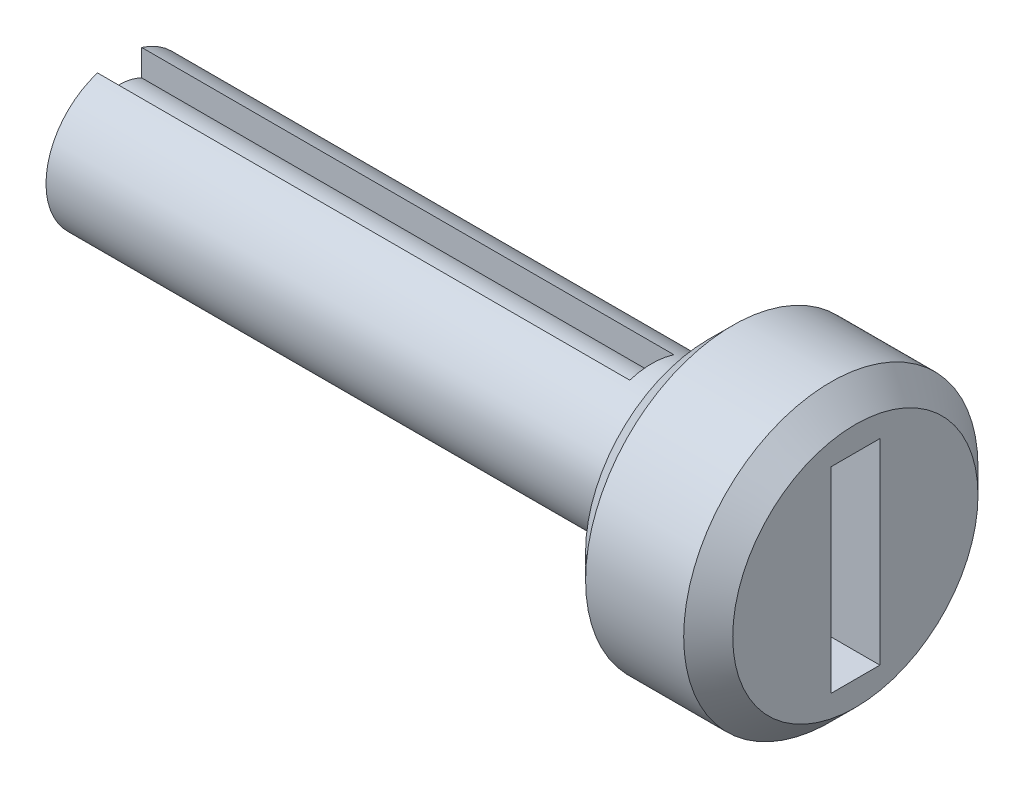
ISO-10303-21;
HEADER;
FILE_DESCRIPTION(('STEP AP214'),'2;1');
FILE_NAME('part.step','',(''),(''),'','','');
FILE_SCHEMA(('AUTOMOTIVE_DESIGN { 1 0 10303 214 1 1 1 1 }'));
ENDSEC;
DATA;
#1=APPLICATION_CONTEXT('core data for automotive mechanical design processes');
#2=APPLICATION_PROTOCOL_DEFINITION('international standard','automotive_design',2000,#1);
#3=PRODUCT_CONTEXT('',#1,'mechanical');
#4=PRODUCT('Part','Part','',(#3));
#5=PRODUCT_RELATED_PRODUCT_CATEGORY('part','',(#4));
#6=PRODUCT_DEFINITION_FORMATION('','',#4);
#7=PRODUCT_DEFINITION_CONTEXT('part definition',#1,'design');
#8=PRODUCT_DEFINITION('design','',#6,#7);
#9=PRODUCT_DEFINITION_SHAPE('','',#8);
#10=(LENGTH_UNIT() NAMED_UNIT(*) SI_UNIT(.MILLI.,.METRE.));
#11=(NAMED_UNIT(*) PLANE_ANGLE_UNIT() SI_UNIT($,.RADIAN.));
#12=(NAMED_UNIT(*) SI_UNIT($,.STERADIAN.) SOLID_ANGLE_UNIT());
#13=UNCERTAINTY_MEASURE_WITH_UNIT(LENGTH_MEASURE(1.E-05),#10,'distance_accuracy_value','');
#14=(GEOMETRIC_REPRESENTATION_CONTEXT(3) GLOBAL_UNCERTAINTY_ASSIGNED_CONTEXT((#13)) GLOBAL_UNIT_ASSIGNED_CONTEXT((#10,
#11,#12)) REPRESENTATION_CONTEXT('',''));
#15=CARTESIAN_POINT('',(0.,0.,0.));
#16=DIRECTION('',(0.,0.,1.));
#17=DIRECTION('',(1.,0.,0.));
#18=AXIS2_PLACEMENT_3D('',#15,#16,#17);
#19=CARTESIAN_POINT('',(0.,0.,0.));
#20=DIRECTION('',(1.,0.,0.));
#21=DIRECTION('',(0.,0.,-1.));
#22=AXIS2_PLACEMENT_3D('',#19,#20,#21);
#23=PLANE('',#22);
#24=CARTESIAN_POINT('',(0.,0.,0.));
#25=DIRECTION('',(-1.,0.,0.));
#26=DIRECTION('',(0.,0.,1.));
#27=AXIS2_PLACEMENT_3D('',#24,#25,#26);
#28=CIRCLE('',#27,1.2);
#29=CARTESIAN_POINT('',(0.,0.,1.2));
#30=VERTEX_POINT('',#29);
#31=EDGE_CURVE('E216',#30,#30,#28,.T.);
#32=ORIENTED_EDGE('',*,*,#31,.F.);
#33=EDGE_LOOP('',(#32));
#34=FACE_BOUND('',#33,.T.);
#35=CARTESIAN_POINT('',(0.,0.,0.));
#36=DIRECTION('',(1.,0.,0.));
#37=DIRECTION('',(0.,0.,1.));
#38=AXIS2_PLACEMENT_3D('',#35,#36,#37);
#39=CIRCLE('',#38,2.);
#40=CARTESIAN_POINT('',(0.,-1.78605710994917,0.9));
#41=VERTEX_POINT('',#40);
#42=CARTESIAN_POINT('',(0.,-1.78605710994917,-0.9));
#43=VERTEX_POINT('',#42);
#44=EDGE_CURVE('E148',#41,#43,#39,.T.);
#45=ORIENTED_EDGE('',*,*,#44,.F.);
#46=DIRECTION('',(0.,1.,0.));
#47=VECTOR('',#46,1.);
#48=CARTESIAN_POINT('',(0.,-1.78605710994917,0.9));
#49=LINE('',#48,#47);
#50=CARTESIAN_POINT('',(0.,-2.86181760425084,0.9));
#51=VERTEX_POINT('',#50);
#52=EDGE_CURVE('E140',#51,#41,#49,.T.);
#53=ORIENTED_EDGE('',*,*,#52,.F.);
#54=CARTESIAN_POINT('',(0.,0.,0.));
#55=DIRECTION('',(-1.,0.,0.));
#56=DIRECTION('',(0.,0.,1.));
#57=AXIS2_PLACEMENT_3D('',#54,#55,#56);
#58=CIRCLE('',#57,3.);
#59=CARTESIAN_POINT('',(0.,2.86181760425084,0.9));
#60=VERTEX_POINT('',#59);
#61=EDGE_CURVE('E57',#51,#60,#58,.T.);
#62=ORIENTED_EDGE('',*,*,#61,.T.);
#63=DIRECTION('',(0.,1.,0.));
#64=VECTOR('',#63,1.);
#65=CARTESIAN_POINT('',(0.,2.86181760425084,0.9));
#66=LINE('',#65,#64);
#67=CARTESIAN_POINT('',(0.,1.78605710994917,0.9));
#68=VERTEX_POINT('',#67);
#69=EDGE_CURVE('E162',#68,#60,#66,.T.);
#70=ORIENTED_EDGE('',*,*,#69,.F.);
#71=CARTESIAN_POINT('',(0.,0.,0.));
#72=DIRECTION('',(1.,0.,0.));
#73=DIRECTION('',(0.,0.,1.));
#74=AXIS2_PLACEMENT_3D('',#71,#72,#73);
#75=CIRCLE('',#74,2.);
#76=CARTESIAN_POINT('',(0.,1.78605710994917,-0.9));
#77=VERTEX_POINT('',#76);
#78=EDGE_CURVE('E165',#77,#68,#75,.T.);
#79=ORIENTED_EDGE('',*,*,#78,.F.);
#80=DIRECTION('',(0.,-1.,0.));
#81=VECTOR('',#80,1.);
#82=CARTESIAN_POINT('',(0.,2.86181760425084,-0.9));
#83=LINE('',#82,#81);
#84=CARTESIAN_POINT('',(0.,2.86181760425084,-0.9));
#85=VERTEX_POINT('',#84);
#86=EDGE_CURVE('E161',#85,#77,#83,.T.);
#87=ORIENTED_EDGE('',*,*,#86,.F.);
#88=CARTESIAN_POINT('',(0.,-2.86181760425084,-0.9));
#89=VERTEX_POINT('',#88);
#90=EDGE_CURVE('E231',#85,#89,#58,.T.);
#91=ORIENTED_EDGE('',*,*,#90,.T.);
#92=DIRECTION('',(0.,-1.,0.));
#93=VECTOR('',#92,1.);
#94=CARTESIAN_POINT('',(0.,-1.78605710994917,-0.9));
#95=LINE('',#94,#93);
#96=EDGE_CURVE('E49',#43,#89,#95,.T.);
#97=ORIENTED_EDGE('',*,*,#96,.F.);
#98=EDGE_LOOP('',(#45,#53,#62,#70,#79,#87,#91,#97));
#99=FACE_BOUND('',#98,.T.);
#100=ADVANCED_FACE('F34',(#34,#99),#23,.F.);
#101=CARTESIAN_POINT('',(0.,0.,0.));
#102=DIRECTION('',(-1.,0.,0.));
#103=DIRECTION('',(0.,0.,1.));
#104=AXIS2_PLACEMENT_3D('',#101,#102,#103);
#105=CYLINDRICAL_SURFACE('',#104,3.);
#106=ORIENTED_EDGE('',*,*,#61,.F.);
#107=DIRECTION('',(-1.,0.,0.));
#108=VECTOR('',#107,1.);
#109=CARTESIAN_POINT('',(26.171095884641,-2.86181760425084,0.900000000000001));
#110=LINE('',#109,#108);
#111=CARTESIAN_POINT('',(21.7,-2.86181760425084,0.900000000000001));
#112=VERTEX_POINT('',#111);
#113=EDGE_CURVE('E154',#112,#51,#110,.T.);
#114=ORIENTED_EDGE('',*,*,#113,.F.);
#115=CARTESIAN_POINT('',(21.7,0.,0.));
#116=DIRECTION('',(1.,0.,0.));
#117=DIRECTION('',(0.,0.,-1.));
#118=AXIS2_PLACEMENT_3D('',#115,#116,#117);
#119=CIRCLE('',#118,3.);
#120=CARTESIAN_POINT('',(21.7,-2.86181760425084,-0.899999999999999));
#121=VERTEX_POINT('',#120);
#122=EDGE_CURVE('E145',#121,#112,#119,.F.);
#123=ORIENTED_EDGE('',*,*,#122,.F.);
#124=DIRECTION('',(-1.,0.,0.));
#125=VECTOR('',#124,1.);
#126=CARTESIAN_POINT('',(26.171095884641,-2.86181760425084,-0.899999999999999));
#127=LINE('',#126,#125);
#128=EDGE_CURVE('E155',#121,#89,#127,.T.);
#129=ORIENTED_EDGE('',*,*,#128,.T.);
#130=ORIENTED_EDGE('',*,*,#90,.F.);
#131=DIRECTION('',(-1.,0.,0.));
#132=VECTOR('',#131,1.);
#133=CARTESIAN_POINT('',(26.171095884641,2.86181760425084,-0.899999999999999));
#134=LINE('',#133,#132);
#135=CARTESIAN_POINT('',(21.7,2.86181760425084,-0.899999999999999));
#136=VERTEX_POINT('',#135);
#137=EDGE_CURVE('E176',#136,#85,#134,.T.);
#138=ORIENTED_EDGE('',*,*,#137,.F.);
#139=CARTESIAN_POINT('',(21.7,0.,0.));
#140=DIRECTION('',(1.,0.,0.));
#141=DIRECTION('',(0.,0.,-1.));
#142=AXIS2_PLACEMENT_3D('',#139,#140,#141);
#143=CIRCLE('',#142,3.);
#144=CARTESIAN_POINT('',(21.7,2.86181760425084,0.900000000000001));
#145=VERTEX_POINT('',#144);
#146=EDGE_CURVE('E173',#145,#136,#143,.F.);
#147=ORIENTED_EDGE('',*,*,#146,.F.);
#148=DIRECTION('',(-1.,0.,0.));
#149=VECTOR('',#148,1.);
#150=CARTESIAN_POINT('',(26.171095884641,2.86181760425084,0.900000000000001));
#151=LINE('',#150,#149);
#152=EDGE_CURVE('E177',#145,#60,#151,.T.);
#153=ORIENTED_EDGE('',*,*,#152,.T.);
#154=EDGE_LOOP('',(#106,#114,#123,#129,#130,#138,#147,#153));
#155=FACE_BOUND('',#154,.T.);
#156=CARTESIAN_POINT('',(24.,0.,0.));
#157=DIRECTION('',(-1.,0.,0.));
#158=DIRECTION('',(0.,0.,1.));
#159=AXIS2_PLACEMENT_3D('',#156,#157,#158);
#160=CIRCLE('',#159,3.);
#161=CARTESIAN_POINT('',(24.,0.,3.));
#162=VERTEX_POINT('',#161);
#163=EDGE_CURVE('E228',#162,#162,#160,.T.);
#164=ORIENTED_EDGE('',*,*,#163,.T.);
#165=EDGE_LOOP('',(#164));
#166=FACE_BOUND('',#165,.T.);
#167=ADVANCED_FACE('F265',(#155,#166),#105,.T.);
#168=CARTESIAN_POINT('',(24.,0.,-3.));
#169=DIRECTION('',(1.,0.,0.));
#170=DIRECTION('',(0.,0.,-1.));
#171=AXIS2_PLACEMENT_3D('',#168,#169,#170);
#172=PLANE('',#171);
#173=CARTESIAN_POINT('',(24.,0.,0.));
#174=DIRECTION('',(1.,0.,0.));
#175=DIRECTION('',(0.,0.,-1.));
#176=AXIS2_PLACEMENT_3D('',#173,#174,#175);
#177=CIRCLE('',#176,5.);
#178=CARTESIAN_POINT('',(24.,0.,-5.));
#179=VERTEX_POINT('',#178);
#180=EDGE_CURVE('E13',#179,#179,#177,.F.);
#181=ORIENTED_EDGE('',*,*,#180,.T.);
#182=EDGE_LOOP('',(#181));
#183=FACE_BOUND('',#182,.T.);
#184=ORIENTED_EDGE('',*,*,#163,.F.);
#185=EDGE_LOOP('',(#184));
#186=FACE_BOUND('',#185,.T.);
#187=ADVANCED_FACE('F254',(#183,#186),#172,.F.);
#188=CARTESIAN_POINT('',(0.,0.,0.));
#189=DIRECTION('',(-1.,0.,0.));
#190=DIRECTION('',(0.,0.,1.));
#191=AXIS2_PLACEMENT_3D('',#188,#189,#190);
#192=CYLINDRICAL_SURFACE('',#191,6.);
#193=CARTESIAN_POINT('',(29.,0.,0.));
#194=DIRECTION('',(-1.,0.,0.));
#195=DIRECTION('',(0.,0.,1.));
#196=AXIS2_PLACEMENT_3D('',#193,#194,#195);
#197=CIRCLE('',#196,6.);
#198=CARTESIAN_POINT('',(29.,0.,6.));
#199=VERTEX_POINT('',#198);
#200=EDGE_CURVE('E237',#199,#199,#197,.T.);
#201=ORIENTED_EDGE('',*,*,#200,.T.);
#202=EDGE_LOOP('',(#201));
#203=FACE_BOUND('',#202,.T.);
#204=CARTESIAN_POINT('',(25.,0.,0.));
#205=DIRECTION('',(1.,0.,0.));
#206=DIRECTION('',(0.,0.,-1.));
#207=AXIS2_PLACEMENT_3D('',#204,#205,#206);
#208=CIRCLE('',#207,6.);
#209=CARTESIAN_POINT('',(25.,0.,-6.));
#210=VERTEX_POINT('',#209);
#211=EDGE_CURVE('E234',#210,#210,#208,.T.);
#212=ORIENTED_EDGE('',*,*,#211,.T.);
#213=EDGE_LOOP('',(#212));
#214=FACE_BOUND('',#213,.T.);
#215=ADVANCED_FACE('F251',(#203,#214),#192,.T.);
#216=CARTESIAN_POINT('',(30.,0.,-6.));
#217=DIRECTION('',(-1.,0.,0.));
#218=DIRECTION('',(0.,0.,1.));
#219=AXIS2_PLACEMENT_3D('',#216,#217,#218);
#220=PLANE('',#219);
#221=CARTESIAN_POINT('',(30.,0.,0.));
#222=DIRECTION('',(-1.,0.,0.));
#223=DIRECTION('',(0.,0.,1.));
#224=AXIS2_PLACEMENT_3D('',#221,#222,#223);
#225=CIRCLE('',#224,5.);
#226=CARTESIAN_POINT('',(30.,0.,5.));
#227=VERTEX_POINT('',#226);
#228=EDGE_CURVE('E42',#227,#227,#225,.F.);
#229=ORIENTED_EDGE('',*,*,#228,.T.);
#230=EDGE_LOOP('',(#229));
#231=FACE_BOUND('',#230,.T.);
#232=DIRECTION('',(0.,0.,1.));
#233=VECTOR('',#232,1.);
#234=CARTESIAN_POINT('',(30.,4.,1.));
#235=LINE('',#234,#233);
#236=CARTESIAN_POINT('',(30.,4.,-0.999999999999999));
#237=VERTEX_POINT('',#236);
#238=CARTESIAN_POINT('',(30.,4.,1.));
#239=VERTEX_POINT('',#238);
#240=EDGE_CURVE('E206',#237,#239,#235,.T.);
#241=ORIENTED_EDGE('',*,*,#240,.F.);
#242=DIRECTION('',(0.,1.,0.));
#243=VECTOR('',#242,1.);
#244=CARTESIAN_POINT('',(30.,-4.,-0.999999999999999));
#245=LINE('',#244,#243);
#246=CARTESIAN_POINT('',(30.,-4.,-0.999999999999999));
#247=VERTEX_POINT('',#246);
#248=EDGE_CURVE('E190',#247,#237,#245,.T.);
#249=ORIENTED_EDGE('',*,*,#248,.F.);
#250=DIRECTION('',(0.,0.,-1.));
#251=VECTOR('',#250,1.);
#252=CARTESIAN_POINT('',(30.,-4.,1.));
#253=LINE('',#252,#251);
#254=CARTESIAN_POINT('',(30.,-4.,1.));
#255=VERTEX_POINT('',#254);
#256=EDGE_CURVE('E195',#255,#247,#253,.T.);
#257=ORIENTED_EDGE('',*,*,#256,.F.);
#258=DIRECTION('',(0.,-1.,0.));
#259=VECTOR('',#258,1.);
#260=CARTESIAN_POINT('',(30.,-4.,1.));
#261=LINE('',#260,#259);
#262=EDGE_CURVE('E209',#239,#255,#261,.T.);
#263=ORIENTED_EDGE('',*,*,#262,.F.);
#264=EDGE_LOOP('',(#241,#249,#257,#263));
#265=FACE_BOUND('',#264,.T.);
#266=ADVANCED_FACE('F242',(#231,#265),#220,.F.);
#267=CARTESIAN_POINT('',(24.,0.,-3.));
#268=DIRECTION('',(1.,0.,0.));
#269=DIRECTION('',(0.,0.,-1.));
#270=AXIS2_PLACEMENT_3D('',#267,#268,#269);
#271=PLANE('',#270);
#272=CARTESIAN_POINT('',(24.,0.,0.));
#273=DIRECTION('',(1.,0.,0.));
#274=DIRECTION('',(0.,0.,-1.));
#275=AXIS2_PLACEMENT_3D('',#272,#273,#274);
#276=CIRCLE('',#275,1.2);
#277=CARTESIAN_POINT('',(24.,0.,-1.2));
#278=VERTEX_POINT('',#277);
#279=EDGE_CURVE('E225',#278,#278,#276,.F.);
#280=ORIENTED_EDGE('',*,*,#279,.T.);
#281=EDGE_LOOP('',(#280));
#282=FACE_BOUND('',#281,.T.);
#283=ADVANCED_FACE('F280',(#282),#271,.F.);
#284=CARTESIAN_POINT('',(27.3941125496954,0.,0.));
#285=DIRECTION('',(-1.,0.,0.));
#286=DIRECTION('',(0.,0.,1.));
#287=AXIS2_PLACEMENT_3D('',#284,#285,#286);
#288=CYLINDRICAL_SURFACE('',#287,1.2);
#289=ORIENTED_EDGE('',*,*,#31,.T.);
#290=EDGE_LOOP('',(#289));
#291=FACE_BOUND('',#290,.T.);
#292=ORIENTED_EDGE('',*,*,#279,.F.);
#293=EDGE_LOOP('',(#292));
#294=FACE_BOUND('',#293,.T.);
#295=ADVANCED_FACE('F283',(#291,#294),#288,.F.);
#296=CARTESIAN_POINT('',(26.,-4.,-0.999999999999999));
#297=DIRECTION('',(0.,0.,-1.));
#298=DIRECTION('',(-1.,0.,0.));
#299=AXIS2_PLACEMENT_3D('',#296,#297,#298);
#300=PLANE('',#299);
#301=ORIENTED_EDGE('',*,*,#248,.T.);
#302=DIRECTION('',(1.,0.,0.));
#303=VECTOR('',#302,1.);
#304=CARTESIAN_POINT('',(26.,4.,-0.999999999999999));
#305=LINE('',#304,#303);
#306=CARTESIAN_POINT('',(26.,4.,-0.999999999999999));
#307=VERTEX_POINT('',#306);
#308=EDGE_CURVE('E204',#307,#237,#305,.T.);
#309=ORIENTED_EDGE('',*,*,#308,.F.);
#310=DIRECTION('',(0.,1.,0.));
#311=VECTOR('',#310,1.);
#312=CARTESIAN_POINT('',(26.,-4.,-0.999999999999999));
#313=LINE('',#312,#311);
#314=CARTESIAN_POINT('',(26.,-4.,-0.999999999999999));
#315=VERTEX_POINT('',#314);
#316=EDGE_CURVE('E191',#315,#307,#313,.T.);
#317=ORIENTED_EDGE('',*,*,#316,.F.);
#318=DIRECTION('',(1.,0.,0.));
#319=VECTOR('',#318,1.);
#320=CARTESIAN_POINT('',(26.,-4.,-0.999999999999999));
#321=LINE('',#320,#319);
#322=EDGE_CURVE('E214',#315,#247,#321,.T.);
#323=ORIENTED_EDGE('',*,*,#322,.T.);
#324=EDGE_LOOP('',(#301,#309,#317,#323));
#325=FACE_BOUND('',#324,.T.);
#326=ADVANCED_FACE('F287',(#325),#300,.F.);
#327=CARTESIAN_POINT('',(26.,-4.,1.));
#328=DIRECTION('',(0.,-1.,0.));
#329=DIRECTION('',(0.,0.,-1.));
#330=AXIS2_PLACEMENT_3D('',#327,#328,#329);
#331=PLANE('',#330);
#332=ORIENTED_EDGE('',*,*,#256,.T.);
#333=ORIENTED_EDGE('',*,*,#322,.F.);
#334=DIRECTION('',(0.,0.,-1.));
#335=VECTOR('',#334,1.);
#336=CARTESIAN_POINT('',(26.,-4.,1.));
#337=LINE('',#336,#335);
#338=CARTESIAN_POINT('',(26.,-4.,1.));
#339=VERTEX_POINT('',#338);
#340=EDGE_CURVE('E201',#339,#315,#337,.T.);
#341=ORIENTED_EDGE('',*,*,#340,.F.);
#342=DIRECTION('',(1.,0.,0.));
#343=VECTOR('',#342,1.);
#344=CARTESIAN_POINT('',(26.,-4.,1.));
#345=LINE('',#344,#343);
#346=EDGE_CURVE('E217',#339,#255,#345,.T.);
#347=ORIENTED_EDGE('',*,*,#346,.T.);
#348=EDGE_LOOP('',(#332,#333,#341,#347));
#349=FACE_BOUND('',#348,.T.);
#350=ADVANCED_FACE('F291',(#349),#331,.F.);
#351=CARTESIAN_POINT('',(26.,-4.,1.));
#352=DIRECTION('',(0.,0.,1.));
#353=DIRECTION('',(1.,0.,0.));
#354=AXIS2_PLACEMENT_3D('',#351,#352,#353);
#355=PLANE('',#354);
#356=ORIENTED_EDGE('',*,*,#262,.T.);
#357=ORIENTED_EDGE('',*,*,#346,.F.);
#358=DIRECTION('',(0.,-1.,0.));
#359=VECTOR('',#358,1.);
#360=CARTESIAN_POINT('',(26.,-4.,1.));
#361=LINE('',#360,#359);
#362=CARTESIAN_POINT('',(26.,4.,1.));
#363=VERTEX_POINT('',#362);
#364=EDGE_CURVE('E198',#363,#339,#361,.T.);
#365=ORIENTED_EDGE('',*,*,#364,.F.);
#366=DIRECTION('',(1.,0.,0.));
#367=VECTOR('',#366,1.);
#368=CARTESIAN_POINT('',(26.,4.,1.));
#369=LINE('',#368,#367);
#370=EDGE_CURVE('E219',#363,#239,#369,.T.);
#371=ORIENTED_EDGE('',*,*,#370,.T.);
#372=EDGE_LOOP('',(#356,#357,#365,#371));
#373=FACE_BOUND('',#372,.T.);
#374=ADVANCED_FACE('F296',(#373),#355,.F.);
#375=CARTESIAN_POINT('',(26.,4.,1.));
#376=DIRECTION('',(0.,1.,0.));
#377=DIRECTION('',(0.,0.,1.));
#378=AXIS2_PLACEMENT_3D('',#375,#376,#377);
#379=PLANE('',#378);
#380=ORIENTED_EDGE('',*,*,#240,.T.);
#381=ORIENTED_EDGE('',*,*,#370,.F.);
#382=DIRECTION('',(0.,0.,1.));
#383=VECTOR('',#382,1.);
#384=CARTESIAN_POINT('',(26.,4.,1.));
#385=LINE('',#384,#383);
#386=EDGE_CURVE('E194',#307,#363,#385,.T.);
#387=ORIENTED_EDGE('',*,*,#386,.F.);
#388=ORIENTED_EDGE('',*,*,#308,.T.);
#389=EDGE_LOOP('',(#380,#381,#387,#388));
#390=FACE_BOUND('',#389,.T.);
#391=ADVANCED_FACE('F293',(#390),#379,.F.);
#392=CARTESIAN_POINT('',(26.,4.,-0.999999999999999));
#393=DIRECTION('',(-1.,0.,0.));
#394=DIRECTION('',(0.,0.,1.));
#395=AXIS2_PLACEMENT_3D('',#392,#393,#394);
#396=PLANE('',#395);
#397=ORIENTED_EDGE('',*,*,#316,.T.);
#398=ORIENTED_EDGE('',*,*,#386,.T.);
#399=ORIENTED_EDGE('',*,*,#364,.T.);
#400=ORIENTED_EDGE('',*,*,#340,.T.);
#401=EDGE_LOOP('',(#397,#398,#399,#400));
#402=FACE_BOUND('',#401,.T.);
#403=ADVANCED_FACE('F248',(#402),#396,.F.);
#404=CARTESIAN_POINT('',(29.,0.,0.));
#405=DIRECTION('',(-1.,0.,0.));
#406=DIRECTION('',(0.,0.,1.));
#407=AXIS2_PLACEMENT_3D('',#404,#405,#406);
#408=CONICAL_SURFACE('',#407,6.,0.78539816339745);
#409=ORIENTED_EDGE('',*,*,#228,.F.);
#410=EDGE_LOOP('',(#409));
#411=FACE_BOUND('',#410,.T.);
#412=ORIENTED_EDGE('',*,*,#200,.F.);
#413=EDGE_LOOP('',(#412));
#414=FACE_BOUND('',#413,.T.);
#415=ADVANCED_FACE('F245',(#411,#414),#408,.T.);
#416=CARTESIAN_POINT('',(24.,0.,0.));
#417=DIRECTION('',(1.,0.,0.));
#418=DIRECTION('',(0.,0.,-1.));
#419=AXIS2_PLACEMENT_3D('',#416,#417,#418);
#420=CONICAL_SURFACE('',#419,5.,0.785398163397447);
#421=ORIENTED_EDGE('',*,*,#211,.F.);
#422=EDGE_LOOP('',(#421));
#423=FACE_BOUND('',#422,.T.);
#424=ORIENTED_EDGE('',*,*,#180,.F.);
#425=EDGE_LOOP('',(#424));
#426=FACE_BOUND('',#425,.T.);
#427=ADVANCED_FACE('F36',(#423,#426),#420,.T.);
#428=CARTESIAN_POINT('',(21.7,0.,-3.));
#429=DIRECTION('',(1.,0.,0.));
#430=DIRECTION('',(0.,0.,-1.));
#431=AXIS2_PLACEMENT_3D('',#428,#429,#430);
#432=PLANE('',#431);
#433=ORIENTED_EDGE('',*,*,#146,.T.);
#434=DIRECTION('',(0.,-1.,0.));
#435=VECTOR('',#434,1.);
#436=CARTESIAN_POINT('',(21.7,2.86181760425084,-0.899999999999999));
#437=LINE('',#436,#435);
#438=CARTESIAN_POINT('',(21.7,1.78605710994917,-0.899999999999999));
#439=VERTEX_POINT('',#438);
#440=EDGE_CURVE('E164',#136,#439,#437,.T.);
#441=ORIENTED_EDGE('',*,*,#440,.T.);
#442=CARTESIAN_POINT('',(21.7,0.,0.));
#443=DIRECTION('',(1.,0.,0.));
#444=DIRECTION('',(0.,0.,-1.));
#445=AXIS2_PLACEMENT_3D('',#442,#443,#444);
#446=CIRCLE('',#445,2.);
#447=CARTESIAN_POINT('',(21.7,1.78605710994918,0.900000000000001));
#448=VERTEX_POINT('',#447);
#449=EDGE_CURVE('E182',#439,#448,#446,.T.);
#450=ORIENTED_EDGE('',*,*,#449,.T.);
#451=DIRECTION('',(0.,1.,0.));
#452=VECTOR('',#451,1.);
#453=CARTESIAN_POINT('',(21.7,2.86181760425084,0.900000000000001));
#454=LINE('',#453,#452);
#455=EDGE_CURVE('E178',#448,#145,#454,.T.);
#456=ORIENTED_EDGE('',*,*,#455,.T.);
#457=EDGE_LOOP('',(#433,#441,#450,#456));
#458=FACE_BOUND('',#457,.T.);
#459=ADVANCED_FACE('F260',(#458),#432,.F.);
#460=CARTESIAN_POINT('',(26.171095884641,2.86181760425084,-0.899999999999999));
#461=DIRECTION('',(0.,0.,-1.));
#462=DIRECTION('',(-1.,0.,0.));
#463=AXIS2_PLACEMENT_3D('',#460,#461,#462);
#464=PLANE('',#463);
#465=ORIENTED_EDGE('',*,*,#137,.T.);
#466=ORIENTED_EDGE('',*,*,#86,.T.);
#467=DIRECTION('',(-1.,0.,0.));
#468=VECTOR('',#467,1.);
#469=CARTESIAN_POINT('',(26.171095884641,1.78605710994917,-0.899999999999999));
#470=LINE('',#469,#468);
#471=EDGE_CURVE('E172',#439,#77,#470,.T.);
#472=ORIENTED_EDGE('',*,*,#471,.F.);
#473=ORIENTED_EDGE('',*,*,#440,.F.);
#474=EDGE_LOOP('',(#465,#466,#472,#473));
#475=FACE_BOUND('',#474,.T.);
#476=ADVANCED_FACE('F309',(#475),#464,.F.);
#477=CARTESIAN_POINT('',(26.171095884641,0.,0.));
#478=DIRECTION('',(-1.,0.,0.));
#479=DIRECTION('',(0.,0.,1.));
#480=AXIS2_PLACEMENT_3D('',#477,#478,#479);
#481=CYLINDRICAL_SURFACE('',#480,2.);
#482=ORIENTED_EDGE('',*,*,#471,.T.);
#483=ORIENTED_EDGE('',*,*,#78,.T.);
#484=DIRECTION('',(-1.,0.,0.));
#485=VECTOR('',#484,1.);
#486=CARTESIAN_POINT('',(26.171095884641,1.78605710994917,0.900000000000001));
#487=LINE('',#486,#485);
#488=EDGE_CURVE('E181',#448,#68,#487,.T.);
#489=ORIENTED_EDGE('',*,*,#488,.F.);
#490=ORIENTED_EDGE('',*,*,#449,.F.);
#491=EDGE_LOOP('',(#482,#483,#489,#490));
#492=FACE_BOUND('',#491,.T.);
#493=ADVANCED_FACE('F313',(#492),#481,.T.);
#494=CARTESIAN_POINT('',(26.171095884641,2.86181760425084,0.900000000000001));
#495=DIRECTION('',(0.,0.,1.));
#496=DIRECTION('',(1.,0.,0.));
#497=AXIS2_PLACEMENT_3D('',#494,#495,#496);
#498=PLANE('',#497);
#499=ORIENTED_EDGE('',*,*,#488,.T.);
#500=ORIENTED_EDGE('',*,*,#69,.T.);
#501=ORIENTED_EDGE('',*,*,#152,.F.);
#502=ORIENTED_EDGE('',*,*,#455,.F.);
#503=EDGE_LOOP('',(#499,#500,#501,#502));
#504=FACE_BOUND('',#503,.T.);
#505=ADVANCED_FACE('F317',(#504),#498,.F.);
#506=CARTESIAN_POINT('',(21.7,0.,-3.));
#507=DIRECTION('',(1.,0.,0.));
#508=DIRECTION('',(0.,0.,-1.));
#509=AXIS2_PLACEMENT_3D('',#506,#507,#508);
#510=PLANE('',#509);
#511=ORIENTED_EDGE('',*,*,#122,.T.);
#512=DIRECTION('',(0.,1.,0.));
#513=VECTOR('',#512,1.);
#514=CARTESIAN_POINT('',(21.7,-1.78605710994917,0.900000000000001));
#515=LINE('',#514,#513);
#516=CARTESIAN_POINT('',(21.7,-1.78605710994917,0.900000000000001));
#517=VERTEX_POINT('',#516);
#518=EDGE_CURVE('E138',#112,#517,#515,.T.);
#519=ORIENTED_EDGE('',*,*,#518,.T.);
#520=CARTESIAN_POINT('',(21.7,0.,0.));
#521=DIRECTION('',(1.,0.,0.));
#522=DIRECTION('',(0.,0.,-1.));
#523=AXIS2_PLACEMENT_3D('',#520,#521,#522);
#524=CIRCLE('',#523,2.);
#525=CARTESIAN_POINT('',(21.7,-1.78605710994917,-0.9));
#526=VERTEX_POINT('',#525);
#527=EDGE_CURVE('E125',#517,#526,#524,.T.);
#528=ORIENTED_EDGE('',*,*,#527,.T.);
#529=DIRECTION('',(0.,-1.,0.));
#530=VECTOR('',#529,1.);
#531=CARTESIAN_POINT('',(21.7,-1.78605710994917,-0.899999999999999));
#532=LINE('',#531,#530);
#533=EDGE_CURVE('E156',#526,#121,#532,.T.);
#534=ORIENTED_EDGE('',*,*,#533,.T.);
#535=EDGE_LOOP('',(#511,#519,#528,#534));
#536=FACE_BOUND('',#535,.T.);
#537=ADVANCED_FACE('F143',(#536),#510,.F.);
#538=CARTESIAN_POINT('',(26.171095884641,-1.78605710994917,0.900000000000001));
#539=DIRECTION('',(0.,0.,1.));
#540=DIRECTION('',(0.,-1.,0.));
#541=AXIS2_PLACEMENT_3D('',#538,#539,#540);
#542=PLANE('',#541);
#543=ORIENTED_EDGE('',*,*,#113,.T.);
#544=ORIENTED_EDGE('',*,*,#52,.T.);
#545=DIRECTION('',(-1.,0.,0.));
#546=VECTOR('',#545,1.);
#547=CARTESIAN_POINT('',(26.171095884641,-1.78605710994917,0.900000000000001));
#548=LINE('',#547,#546);
#549=EDGE_CURVE('E129',#517,#41,#548,.T.);
#550=ORIENTED_EDGE('',*,*,#549,.F.);
#551=ORIENTED_EDGE('',*,*,#518,.F.);
#552=EDGE_LOOP('',(#543,#544,#550,#551));
#553=FACE_BOUND('',#552,.T.);
#554=ADVANCED_FACE('F137',(#553),#542,.F.);
#555=CARTESIAN_POINT('',(26.171095884641,0.,0.));
#556=DIRECTION('',(-1.,0.,0.));
#557=DIRECTION('',(0.,0.,1.));
#558=AXIS2_PLACEMENT_3D('',#555,#556,#557);
#559=CYLINDRICAL_SURFACE('',#558,2.);
#560=ORIENTED_EDGE('',*,*,#549,.T.);
#561=ORIENTED_EDGE('',*,*,#44,.T.);
#562=DIRECTION('',(-1.,0.,0.));
#563=VECTOR('',#562,1.);
#564=CARTESIAN_POINT('',(26.171095884641,-1.78605710994917,-0.9));
#565=LINE('',#564,#563);
#566=EDGE_CURVE('E131',#526,#43,#565,.T.);
#567=ORIENTED_EDGE('',*,*,#566,.F.);
#568=ORIENTED_EDGE('',*,*,#527,.F.);
#569=EDGE_LOOP('',(#560,#561,#567,#568));
#570=FACE_BOUND('',#569,.T.);
#571=ADVANCED_FACE('F127',(#570),#559,.T.);
#572=CARTESIAN_POINT('',(26.171095884641,-1.78605710994917,-0.899999999999999));
#573=DIRECTION('',(0.,0.,-1.));
#574=DIRECTION('',(-1.,0.,0.));
#575=AXIS2_PLACEMENT_3D('',#572,#573,#574);
#576=PLANE('',#575);
#577=ORIENTED_EDGE('',*,*,#566,.T.);
#578=ORIENTED_EDGE('',*,*,#96,.T.);
#579=ORIENTED_EDGE('',*,*,#128,.F.);
#580=ORIENTED_EDGE('',*,*,#533,.F.);
#581=EDGE_LOOP('',(#577,#578,#579,#580));
#582=FACE_BOUND('',#581,.T.);
#583=ADVANCED_FACE('F328',(#582),#576,.F.);
#584=CLOSED_SHELL('',(#100,#167,#187,#215,#266,#283,#295,#326,#350,#374,#391,#403,#415,#427,
#459,#476,#493,#505,#537,#554,#571,#583));
#585=MANIFOLD_SOLID_BREP('B2',#584);
#586=ADVANCED_BREP_SHAPE_REPRESENTATION('',(#18,#585),#14);
#587=SHAPE_DEFINITION_REPRESENTATION(#9,#586);
ENDSEC;
END-ISO-10303-21;
